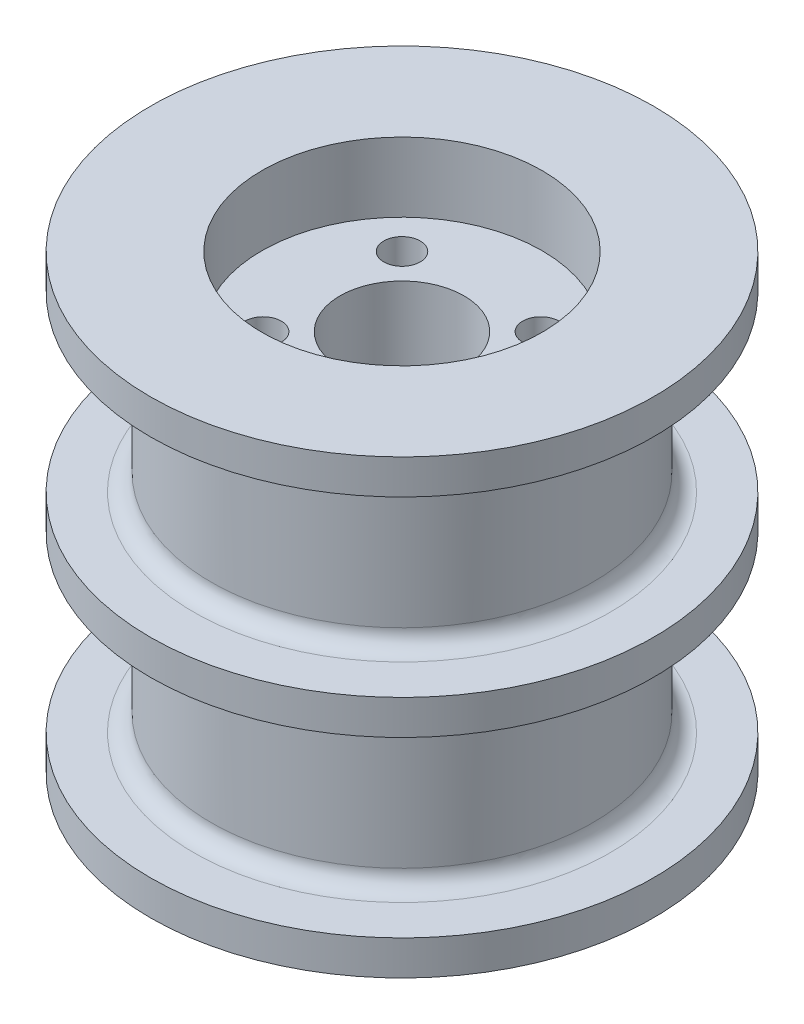
ISO-10303-21;
HEADER;
FILE_DESCRIPTION(('STEP AP214'),'2;1');
FILE_NAME('part.step','',(''),(''),'','','');
FILE_SCHEMA(('AUTOMOTIVE_DESIGN { 1 0 10303 214 1 1 1 1 }'));
ENDSEC;
DATA;
#1=APPLICATION_CONTEXT('core data for automotive mechanical design processes');
#2=APPLICATION_PROTOCOL_DEFINITION('international standard','automotive_design',2000,#1);
#3=PRODUCT_CONTEXT('',#1,'mechanical');
#4=PRODUCT('Part','Part','',(#3));
#5=PRODUCT_RELATED_PRODUCT_CATEGORY('part','',(#4));
#6=PRODUCT_DEFINITION_FORMATION('','',#4);
#7=PRODUCT_DEFINITION_CONTEXT('part definition',#1,'design');
#8=PRODUCT_DEFINITION('design','',#6,#7);
#9=PRODUCT_DEFINITION_SHAPE('','',#8);
#10=(LENGTH_UNIT() NAMED_UNIT(*) SI_UNIT(.MILLI.,.METRE.));
#11=(NAMED_UNIT(*) PLANE_ANGLE_UNIT() SI_UNIT($,.RADIAN.));
#12=(NAMED_UNIT(*) SI_UNIT($,.STERADIAN.) SOLID_ANGLE_UNIT());
#13=UNCERTAINTY_MEASURE_WITH_UNIT(LENGTH_MEASURE(1.E-05),#10,'distance_accuracy_value','');
#14=(GEOMETRIC_REPRESENTATION_CONTEXT(3) GLOBAL_UNCERTAINTY_ASSIGNED_CONTEXT((#13)) GLOBAL_UNIT_ASSIGNED_CONTEXT((#10,
#11,#12)) REPRESENTATION_CONTEXT('',''));
#15=CARTESIAN_POINT('',(0.,0.,0.));
#16=DIRECTION('',(0.,0.,1.));
#17=DIRECTION('',(1.,0.,0.));
#18=AXIS2_PLACEMENT_3D('',#15,#16,#17);
#19=CARTESIAN_POINT('',(0.,0.,0.));
#20=DIRECTION('',(0.,-1.,0.));
#21=DIRECTION('',(0.,0.,-1.));
#22=AXIS2_PLACEMENT_3D('',#19,#20,#21);
#23=CYLINDRICAL_SURFACE('',#22,16.15);
#24=CARTESIAN_POINT('',(0.,52.,0.));
#25=DIRECTION('',(0.,-1.,0.));
#26=DIRECTION('',(0.,0.,-1.));
#27=AXIS2_PLACEMENT_3D('',#24,#25,#26);
#28=CIRCLE('',#27,16.15);
#29=CARTESIAN_POINT('',(0.,52.,-16.15));
#30=VERTEX_POINT('',#29);
#31=EDGE_CURVE('E75',#30,#30,#28,.T.);
#32=ORIENTED_EDGE('',*,*,#31,.F.);
#33=EDGE_LOOP('',(#32));
#34=FACE_BOUND('',#33,.T.);
#35=CARTESIAN_POINT('',(0.,44.0000000000001,0.));
#36=DIRECTION('',(0.,-1.,0.));
#37=DIRECTION('',(0.,0.,-1.));
#38=AXIS2_PLACEMENT_3D('',#35,#36,#37);
#39=CIRCLE('',#38,16.15);
#40=CARTESIAN_POINT('',(0.,44.0000000000001,-16.15));
#41=VERTEX_POINT('',#40);
#42=EDGE_CURVE('E108',#41,#41,#39,.T.);
#43=ORIENTED_EDGE('',*,*,#42,.T.);
#44=EDGE_LOOP('',(#43));
#45=FACE_BOUND('',#44,.T.);
#46=ADVANCED_FACE('F43',(#34,#45),#23,.F.);
#47=CARTESIAN_POINT('',(0.,52.,16.15));
#48=DIRECTION('',(0.,-1.,0.));
#49=DIRECTION('',(0.,0.,-1.));
#50=AXIS2_PLACEMENT_3D('',#47,#48,#49);
#51=PLANE('',#50);
#52=CARTESIAN_POINT('',(0.,52.,0.));
#53=DIRECTION('',(0.,-1.,0.));
#54=DIRECTION('',(0.,0.,-1.));
#55=AXIS2_PLACEMENT_3D('',#52,#53,#54);
#56=CIRCLE('',#55,29.);
#57=CARTESIAN_POINT('',(0.,52.,-29.));
#58=VERTEX_POINT('',#57);
#59=EDGE_CURVE('E78',#58,#58,#56,.T.);
#60=ORIENTED_EDGE('',*,*,#59,.F.);
#61=EDGE_LOOP('',(#60));
#62=FACE_BOUND('',#61,.T.);
#63=ORIENTED_EDGE('',*,*,#31,.T.);
#64=EDGE_LOOP('',(#63));
#65=FACE_BOUND('',#64,.T.);
#66=ADVANCED_FACE('F195',(#62,#65),#51,.F.);
#67=CARTESIAN_POINT('',(0.,0.,0.));
#68=DIRECTION('',(0.,-1.,0.));
#69=DIRECTION('',(0.,0.,-1.));
#70=AXIS2_PLACEMENT_3D('',#67,#68,#69);
#71=CYLINDRICAL_SURFACE('',#70,29.);
#72=CARTESIAN_POINT('',(0.,48.,0.));
#73=DIRECTION('',(0.,-1.,0.));
#74=DIRECTION('',(0.,0.,-1.));
#75=AXIS2_PLACEMENT_3D('',#72,#73,#74);
#76=CIRCLE('',#75,29.);
#77=CARTESIAN_POINT('',(0.,48.,-29.));
#78=VERTEX_POINT('',#77);
#79=EDGE_CURVE('E81',#78,#78,#76,.T.);
#80=ORIENTED_EDGE('',*,*,#79,.F.);
#81=EDGE_LOOP('',(#80));
#82=FACE_BOUND('',#81,.T.);
#83=ORIENTED_EDGE('',*,*,#59,.T.);
#84=EDGE_LOOP('',(#83));
#85=FACE_BOUND('',#84,.T.);
#86=ADVANCED_FACE('F201',(#82,#85),#71,.T.);
#87=CARTESIAN_POINT('',(0.,48.,29.));
#88=DIRECTION('',(0.,1.,0.));
#89=DIRECTION('',(0.,0.,1.));
#90=AXIS2_PLACEMENT_3D('',#87,#88,#89);
#91=PLANE('',#90);
#92=CARTESIAN_POINT('',(0.,48.,0.));
#93=DIRECTION('',(0.,1.,0.));
#94=DIRECTION('',(0.,0.,1.));
#95=AXIS2_PLACEMENT_3D('',#92,#93,#94);
#96=CIRCLE('',#95,24.);
#97=CARTESIAN_POINT('',(0.,48.,24.));
#98=VERTEX_POINT('',#97);
#99=EDGE_CURVE('E50',#98,#98,#96,.T.);
#100=ORIENTED_EDGE('',*,*,#99,.T.);
#101=EDGE_LOOP('',(#100));
#102=FACE_BOUND('',#101,.T.);
#103=ORIENTED_EDGE('',*,*,#79,.T.);
#104=EDGE_LOOP('',(#103));
#105=FACE_BOUND('',#104,.T.);
#106=ADVANCED_FACE('F229',(#102,#105),#91,.F.);
#107=CARTESIAN_POINT('',(0.,0.,0.));
#108=DIRECTION('',(0.,-1.,0.));
#109=DIRECTION('',(0.,0.,-1.));
#110=AXIS2_PLACEMENT_3D('',#107,#108,#109);
#111=CYLINDRICAL_SURFACE('',#110,22.);
#112=CARTESIAN_POINT('',(0.,46.,0.));
#113=DIRECTION('',(0.,1.,0.));
#114=DIRECTION('',(0.,0.,1.));
#115=AXIS2_PLACEMENT_3D('',#112,#113,#114);
#116=CIRCLE('',#115,22.);
#117=CARTESIAN_POINT('',(0.,46.,22.));
#118=VERTEX_POINT('',#117);
#119=EDGE_CURVE('E54',#118,#118,#116,.F.);
#120=ORIENTED_EDGE('',*,*,#119,.T.);
#121=EDGE_LOOP('',(#120));
#122=FACE_BOUND('',#121,.T.);
#123=CARTESIAN_POINT('',(0.,30.,0.));
#124=DIRECTION('',(0.,-1.,0.));
#125=DIRECTION('',(0.,0.,-1.));
#126=AXIS2_PLACEMENT_3D('',#123,#124,#125);
#127=CIRCLE('',#126,22.);
#128=CARTESIAN_POINT('',(0.,30.,-22.));
#129=VERTEX_POINT('',#128);
#130=EDGE_CURVE('E58',#129,#129,#127,.F.);
#131=ORIENTED_EDGE('',*,*,#130,.T.);
#132=EDGE_LOOP('',(#131));
#133=FACE_BOUND('',#132,.T.);
#134=ADVANCED_FACE('F225',(#122,#133),#111,.T.);
#135=CARTESIAN_POINT('',(0.,28.,22.));
#136=DIRECTION('',(0.,-1.,0.));
#137=DIRECTION('',(0.,0.,-1.));
#138=AXIS2_PLACEMENT_3D('',#135,#136,#137);
#139=PLANE('',#138);
#140=CARTESIAN_POINT('',(0.,28.,0.));
#141=DIRECTION('',(0.,-1.,0.));
#142=DIRECTION('',(0.,0.,-1.));
#143=AXIS2_PLACEMENT_3D('',#140,#141,#142);
#144=CIRCLE('',#143,24.);
#145=CARTESIAN_POINT('',(0.,28.,-24.));
#146=VERTEX_POINT('',#145);
#147=EDGE_CURVE('E10',#146,#146,#144,.T.);
#148=ORIENTED_EDGE('',*,*,#147,.T.);
#149=EDGE_LOOP('',(#148));
#150=FACE_BOUND('',#149,.T.);
#151=CARTESIAN_POINT('',(0.,28.,0.));
#152=DIRECTION('',(0.,-1.,0.));
#153=DIRECTION('',(0.,0.,-1.));
#154=AXIS2_PLACEMENT_3D('',#151,#152,#153);
#155=CIRCLE('',#154,29.);
#156=CARTESIAN_POINT('',(0.,28.,-29.));
#157=VERTEX_POINT('',#156);
#158=EDGE_CURVE('E84',#157,#157,#155,.T.);
#159=ORIENTED_EDGE('',*,*,#158,.F.);
#160=EDGE_LOOP('',(#159));
#161=FACE_BOUND('',#160,.T.);
#162=ADVANCED_FACE('F228',(#150,#161),#139,.F.);
#163=CARTESIAN_POINT('',(0.,0.,0.));
#164=DIRECTION('',(0.,-1.,0.));
#165=DIRECTION('',(0.,0.,-1.));
#166=AXIS2_PLACEMENT_3D('',#163,#164,#165);
#167=CYLINDRICAL_SURFACE('',#166,29.);
#168=CARTESIAN_POINT('',(0.,24.,0.));
#169=DIRECTION('',(0.,-1.,0.));
#170=DIRECTION('',(0.,0.,-1.));
#171=AXIS2_PLACEMENT_3D('',#168,#169,#170);
#172=CIRCLE('',#171,29.);
#173=CARTESIAN_POINT('',(0.,24.,-29.));
#174=VERTEX_POINT('',#173);
#175=EDGE_CURVE('E87',#174,#174,#172,.T.);
#176=ORIENTED_EDGE('',*,*,#175,.F.);
#177=EDGE_LOOP('',(#176));
#178=FACE_BOUND('',#177,.T.);
#179=ORIENTED_EDGE('',*,*,#158,.T.);
#180=EDGE_LOOP('',(#179));
#181=FACE_BOUND('',#180,.T.);
#182=ADVANCED_FACE('F237',(#178,#181),#167,.T.);
#183=CARTESIAN_POINT('',(0.,24.,29.));
#184=DIRECTION('',(0.,1.,0.));
#185=DIRECTION('',(0.,0.,1.));
#186=AXIS2_PLACEMENT_3D('',#183,#184,#185);
#187=PLANE('',#186);
#188=CARTESIAN_POINT('',(0.,24.,0.));
#189=DIRECTION('',(0.,1.,0.));
#190=DIRECTION('',(0.,0.,1.));
#191=AXIS2_PLACEMENT_3D('',#188,#189,#190);
#192=CIRCLE('',#191,24.);
#193=CARTESIAN_POINT('',(0.,24.,24.));
#194=VERTEX_POINT('',#193);
#195=EDGE_CURVE('E66',#194,#194,#192,.T.);
#196=ORIENTED_EDGE('',*,*,#195,.T.);
#197=EDGE_LOOP('',(#196));
#198=FACE_BOUND('',#197,.T.);
#199=ORIENTED_EDGE('',*,*,#175,.T.);
#200=EDGE_LOOP('',(#199));
#201=FACE_BOUND('',#200,.T.);
#202=ADVANCED_FACE('F191',(#198,#201),#187,.F.);
#203=CARTESIAN_POINT('',(0.,0.,0.));
#204=DIRECTION('',(0.,-1.,0.));
#205=DIRECTION('',(0.,0.,-1.));
#206=AXIS2_PLACEMENT_3D('',#203,#204,#205);
#207=CYLINDRICAL_SURFACE('',#206,22.);
#208=CARTESIAN_POINT('',(0.,22.,0.));
#209=DIRECTION('',(0.,1.,0.));
#210=DIRECTION('',(0.,0.,1.));
#211=AXIS2_PLACEMENT_3D('',#208,#209,#210);
#212=CIRCLE('',#211,22.);
#213=CARTESIAN_POINT('',(0.,22.,22.));
#214=VERTEX_POINT('',#213);
#215=EDGE_CURVE('E69',#214,#214,#212,.F.);
#216=ORIENTED_EDGE('',*,*,#215,.T.);
#217=EDGE_LOOP('',(#216));
#218=FACE_BOUND('',#217,.T.);
#219=CARTESIAN_POINT('',(0.,6.,0.));
#220=DIRECTION('',(0.,-1.,0.));
#221=DIRECTION('',(0.,0.,-1.));
#222=AXIS2_PLACEMENT_3D('',#219,#220,#221);
#223=CIRCLE('',#222,22.);
#224=CARTESIAN_POINT('',(0.,6.,-22.));
#225=VERTEX_POINT('',#224);
#226=EDGE_CURVE('E72',#225,#225,#223,.F.);
#227=ORIENTED_EDGE('',*,*,#226,.T.);
#228=EDGE_LOOP('',(#227));
#229=FACE_BOUND('',#228,.T.);
#230=ADVANCED_FACE('F184',(#218,#229),#207,.T.);
#231=CARTESIAN_POINT('',(0.,4.,22.));
#232=DIRECTION('',(0.,-1.,0.));
#233=DIRECTION('',(0.,0.,-1.));
#234=AXIS2_PLACEMENT_3D('',#231,#232,#233);
#235=PLANE('',#234);
#236=CARTESIAN_POINT('',(0.,4.,0.));
#237=DIRECTION('',(0.,-1.,0.));
#238=DIRECTION('',(0.,0.,-1.));
#239=AXIS2_PLACEMENT_3D('',#236,#237,#238);
#240=CIRCLE('',#239,24.);
#241=CARTESIAN_POINT('',(0.,4.,-24.));
#242=VERTEX_POINT('',#241);
#243=EDGE_CURVE('E63',#242,#242,#240,.T.);
#244=ORIENTED_EDGE('',*,*,#243,.T.);
#245=EDGE_LOOP('',(#244));
#246=FACE_BOUND('',#245,.T.);
#247=CARTESIAN_POINT('',(0.,4.,0.));
#248=DIRECTION('',(0.,-1.,0.));
#249=DIRECTION('',(0.,0.,-1.));
#250=AXIS2_PLACEMENT_3D('',#247,#248,#249);
#251=CIRCLE('',#250,29.);
#252=CARTESIAN_POINT('',(0.,4.,-29.));
#253=VERTEX_POINT('',#252);
#254=EDGE_CURVE('E90',#253,#253,#251,.T.);
#255=ORIENTED_EDGE('',*,*,#254,.F.);
#256=EDGE_LOOP('',(#255));
#257=FACE_BOUND('',#256,.T.);
#258=ADVANCED_FACE('F179',(#246,#257),#235,.F.);
#259=CARTESIAN_POINT('',(0.,0.,0.));
#260=DIRECTION('',(0.,-1.,0.));
#261=DIRECTION('',(0.,0.,-1.));
#262=AXIS2_PLACEMENT_3D('',#259,#260,#261);
#263=CYLINDRICAL_SURFACE('',#262,29.);
#264=CARTESIAN_POINT('',(0.,0.,0.));
#265=DIRECTION('',(0.,-1.,0.));
#266=DIRECTION('',(0.,0.,-1.));
#267=AXIS2_PLACEMENT_3D('',#264,#265,#266);
#268=CIRCLE('',#267,29.);
#269=CARTESIAN_POINT('',(0.,0.,-29.));
#270=VERTEX_POINT('',#269);
#271=EDGE_CURVE('E93',#270,#270,#268,.T.);
#272=ORIENTED_EDGE('',*,*,#271,.F.);
#273=EDGE_LOOP('',(#272));
#274=FACE_BOUND('',#273,.T.);
#275=ORIENTED_EDGE('',*,*,#254,.T.);
#276=EDGE_LOOP('',(#275));
#277=FACE_BOUND('',#276,.T.);
#278=ADVANCED_FACE('F173',(#274,#277),#263,.T.);
#279=CARTESIAN_POINT('',(0.,0.,29.));
#280=DIRECTION('',(0.,1.,0.));
#281=DIRECTION('',(0.,0.,1.));
#282=AXIS2_PLACEMENT_3D('',#279,#280,#281);
#283=PLANE('',#282);
#284=CARTESIAN_POINT('',(0.,0.,0.));
#285=DIRECTION('',(0.,-1.,0.));
#286=DIRECTION('',(0.,0.,-1.));
#287=AXIS2_PLACEMENT_3D('',#284,#285,#286);
#288=CIRCLE('',#287,16.15);
#289=CARTESIAN_POINT('',(0.,0.,-16.15));
#290=VERTEX_POINT('',#289);
#291=EDGE_CURVE('E96',#290,#290,#288,.T.);
#292=ORIENTED_EDGE('',*,*,#291,.F.);
#293=EDGE_LOOP('',(#292));
#294=FACE_BOUND('',#293,.T.);
#295=ORIENTED_EDGE('',*,*,#271,.T.);
#296=EDGE_LOOP('',(#295));
#297=FACE_BOUND('',#296,.T.);
#298=ADVANCED_FACE('F167',(#294,#297),#283,.F.);
#299=CARTESIAN_POINT('',(0.,0.,0.));
#300=DIRECTION('',(0.,-1.,0.));
#301=DIRECTION('',(0.,0.,-1.));
#302=AXIS2_PLACEMENT_3D('',#299,#300,#301);
#303=CYLINDRICAL_SURFACE('',#302,16.15);
#304=CARTESIAN_POINT('',(0.,8.,0.));
#305=DIRECTION('',(0.,-1.,0.));
#306=DIRECTION('',(0.,0.,-1.));
#307=AXIS2_PLACEMENT_3D('',#304,#305,#306);
#308=CIRCLE('',#307,16.15);
#309=CARTESIAN_POINT('',(0.,8.,-16.15));
#310=VERTEX_POINT('',#309);
#311=EDGE_CURVE('E99',#310,#310,#308,.T.);
#312=ORIENTED_EDGE('',*,*,#311,.F.);
#313=EDGE_LOOP('',(#312));
#314=FACE_BOUND('',#313,.T.);
#315=ORIENTED_EDGE('',*,*,#291,.T.);
#316=EDGE_LOOP('',(#315));
#317=FACE_BOUND('',#316,.T.);
#318=ADVANCED_FACE('F160',(#314,#317),#303,.F.);
#319=CARTESIAN_POINT('',(0.,8.,16.15));
#320=DIRECTION('',(0.,1.,0.));
#321=DIRECTION('',(0.,0.,1.));
#322=AXIS2_PLACEMENT_3D('',#319,#320,#321);
#323=PLANE('',#322);
#324=CARTESIAN_POINT('',(-8.,8.,8.));
#325=DIRECTION('',(0.,1.,0.));
#326=DIRECTION('',(0.,0.,1.));
#327=AXIS2_PLACEMENT_3D('',#324,#325,#326);
#328=CIRCLE('',#327,2.1);
#329=CARTESIAN_POINT('',(-8.,8.,10.1));
#330=VERTEX_POINT('',#329);
#331=EDGE_CURVE('E111',#330,#330,#328,.T.);
#332=ORIENTED_EDGE('',*,*,#331,.T.);
#333=EDGE_LOOP('',(#332));
#334=FACE_BOUND('',#333,.T.);
#335=CARTESIAN_POINT('',(8.,8.,8.));
#336=DIRECTION('',(0.,1.,0.));
#337=DIRECTION('',(0.,0.,1.));
#338=AXIS2_PLACEMENT_3D('',#335,#336,#337);
#339=CIRCLE('',#338,2.1);
#340=CARTESIAN_POINT('',(8.,8.,10.1));
#341=VERTEX_POINT('',#340);
#342=EDGE_CURVE('E114',#341,#341,#339,.T.);
#343=ORIENTED_EDGE('',*,*,#342,.T.);
#344=EDGE_LOOP('',(#343));
#345=FACE_BOUND('',#344,.T.);
#346=CARTESIAN_POINT('',(8.,8.,-8.));
#347=DIRECTION('',(0.,1.,0.));
#348=DIRECTION('',(0.,0.,1.));
#349=AXIS2_PLACEMENT_3D('',#346,#347,#348);
#350=CIRCLE('',#349,2.1);
#351=CARTESIAN_POINT('',(8.,8.,-5.9));
#352=VERTEX_POINT('',#351);
#353=EDGE_CURVE('E117',#352,#352,#350,.T.);
#354=ORIENTED_EDGE('',*,*,#353,.T.);
#355=EDGE_LOOP('',(#354));
#356=FACE_BOUND('',#355,.T.);
#357=CARTESIAN_POINT('',(-8.,8.,-8.));
#358=DIRECTION('',(0.,1.,0.));
#359=DIRECTION('',(0.,0.,1.));
#360=AXIS2_PLACEMENT_3D('',#357,#358,#359);
#361=CIRCLE('',#360,2.1);
#362=CARTESIAN_POINT('',(-8.,8.,-5.9));
#363=VERTEX_POINT('',#362);
#364=EDGE_CURVE('E120',#363,#363,#361,.T.);
#365=ORIENTED_EDGE('',*,*,#364,.T.);
#366=EDGE_LOOP('',(#365));
#367=FACE_BOUND('',#366,.T.);
#368=CARTESIAN_POINT('',(0.,8.,0.));
#369=DIRECTION('',(0.,-1.,0.));
#370=DIRECTION('',(0.,0.,-1.));
#371=AXIS2_PLACEMENT_3D('',#368,#369,#370);
#372=CIRCLE('',#371,7.15);
#373=CARTESIAN_POINT('',(0.,8.,-7.15));
#374=VERTEX_POINT('',#373);
#375=EDGE_CURVE('E102',#374,#374,#372,.T.);
#376=ORIENTED_EDGE('',*,*,#375,.F.);
#377=EDGE_LOOP('',(#376));
#378=FACE_BOUND('',#377,.T.);
#379=ORIENTED_EDGE('',*,*,#311,.T.);
#380=EDGE_LOOP('',(#379));
#381=FACE_BOUND('',#380,.T.);
#382=ADVANCED_FACE('F154',(#334,#345,#356,#367,#378,#381),#323,.F.);
#383=CARTESIAN_POINT('',(0.,0.,0.));
#384=DIRECTION('',(0.,-1.,0.));
#385=DIRECTION('',(0.,0.,-1.));
#386=AXIS2_PLACEMENT_3D('',#383,#384,#385);
#387=CYLINDRICAL_SURFACE('',#386,7.15);
#388=CARTESIAN_POINT('',(0.,44.0000000000001,0.));
#389=DIRECTION('',(0.,-1.,0.));
#390=DIRECTION('',(0.,0.,-1.));
#391=AXIS2_PLACEMENT_3D('',#388,#389,#390);
#392=CIRCLE('',#391,7.15000000000001);
#393=CARTESIAN_POINT('',(0.,44.0000000000001,-7.15000000000001));
#394=VERTEX_POINT('',#393);
#395=EDGE_CURVE('E105',#394,#394,#392,.T.);
#396=ORIENTED_EDGE('',*,*,#395,.F.);
#397=EDGE_LOOP('',(#396));
#398=FACE_BOUND('',#397,.T.);
#399=ORIENTED_EDGE('',*,*,#375,.T.);
#400=EDGE_LOOP('',(#399));
#401=FACE_BOUND('',#400,.T.);
#402=ADVANCED_FACE('F143',(#398,#401),#387,.F.);
#403=CARTESIAN_POINT('',(0.,44.0000000000001,7.15000000000001));
#404=DIRECTION('',(0.,-1.,0.));
#405=DIRECTION('',(0.,0.,-1.));
#406=AXIS2_PLACEMENT_3D('',#403,#404,#405);
#407=PLANE('',#406);
#408=CARTESIAN_POINT('',(-8.,44.0000000000001,8.));
#409=DIRECTION('',(0.,1.,0.));
#410=DIRECTION('',(0.,0.,1.));
#411=AXIS2_PLACEMENT_3D('',#408,#409,#410);
#412=CIRCLE('',#411,2.1);
#413=CARTESIAN_POINT('',(-8.,44.0000000000001,10.1));
#414=VERTEX_POINT('',#413);
#415=EDGE_CURVE('E127',#414,#414,#412,.T.);
#416=ORIENTED_EDGE('',*,*,#415,.F.);
#417=EDGE_LOOP('',(#416));
#418=FACE_BOUND('',#417,.T.);
#419=CARTESIAN_POINT('',(8.,44.0000000000001,8.));
#420=DIRECTION('',(0.,1.,0.));
#421=DIRECTION('',(0.,0.,1.));
#422=AXIS2_PLACEMENT_3D('',#419,#420,#421);
#423=CIRCLE('',#422,2.1);
#424=CARTESIAN_POINT('',(8.,44.0000000000001,10.1));
#425=VERTEX_POINT('',#424);
#426=EDGE_CURVE('E130',#425,#425,#423,.T.);
#427=ORIENTED_EDGE('',*,*,#426,.F.);
#428=EDGE_LOOP('',(#427));
#429=FACE_BOUND('',#428,.T.);
#430=CARTESIAN_POINT('',(8.,44.0000000000001,-8.));
#431=DIRECTION('',(0.,1.,0.));
#432=DIRECTION('',(0.,0.,1.));
#433=AXIS2_PLACEMENT_3D('',#430,#431,#432);
#434=CIRCLE('',#433,2.1);
#435=CARTESIAN_POINT('',(8.,44.0000000000001,-5.9));
#436=VERTEX_POINT('',#435);
#437=EDGE_CURVE('E126',#436,#436,#434,.T.);
#438=ORIENTED_EDGE('',*,*,#437,.F.);
#439=EDGE_LOOP('',(#438));
#440=FACE_BOUND('',#439,.T.);
#441=CARTESIAN_POINT('',(-8.,44.0000000000001,-8.));
#442=DIRECTION('',(0.,1.,0.));
#443=DIRECTION('',(0.,0.,1.));
#444=AXIS2_PLACEMENT_3D('',#441,#442,#443);
#445=CIRCLE('',#444,2.1);
#446=CARTESIAN_POINT('',(-8.,44.0000000000001,-5.9));
#447=VERTEX_POINT('',#446);
#448=EDGE_CURVE('E123',#447,#447,#445,.T.);
#449=ORIENTED_EDGE('',*,*,#448,.F.);
#450=EDGE_LOOP('',(#449));
#451=FACE_BOUND('',#450,.T.);
#452=ORIENTED_EDGE('',*,*,#42,.F.);
#453=EDGE_LOOP('',(#452));
#454=FACE_BOUND('',#453,.T.);
#455=ORIENTED_EDGE('',*,*,#395,.T.);
#456=EDGE_LOOP('',(#455));
#457=FACE_BOUND('',#456,.T.);
#458=ADVANCED_FACE('F139',(#418,#429,#440,#451,#454,#457),#407,.F.);
#459=CARTESIAN_POINT('',(-8.,0.,-8.));
#460=DIRECTION('',(0.,1.,0.));
#461=DIRECTION('',(0.,0.,1.));
#462=AXIS2_PLACEMENT_3D('',#459,#460,#461);
#463=CYLINDRICAL_SURFACE('',#462,2.1);
#464=CARTESIAN_POINT('',(-8.,44.0000000000001,-5.9));
#465=CARTESIAN_POINT('',(-8.,43.6250000000001,-5.9));
#466=CARTESIAN_POINT('',(-8.,43.2500000000001,-5.9));
#467=CARTESIAN_POINT('',(-8.,42.5000000000001,-5.9));
#468=CARTESIAN_POINT('',(-8.,42.1250000000001,-5.9));
#469=CARTESIAN_POINT('',(-8.,41.3750000000001,-5.9));
#470=CARTESIAN_POINT('',(-8.,41.0000000000001,-5.9));
#471=CARTESIAN_POINT('',(-8.,40.2500000000001,-5.9));
#472=CARTESIAN_POINT('',(-8.,39.875,-5.9));
#473=CARTESIAN_POINT('',(-8.,39.125,-5.9));
#474=CARTESIAN_POINT('',(-8.,38.75,-5.9));
#475=CARTESIAN_POINT('',(-8.,38.,-5.9));
#476=CARTESIAN_POINT('',(-8.,37.625,-5.9));
#477=CARTESIAN_POINT('',(-8.,36.875,-5.9));
#478=CARTESIAN_POINT('',(-8.,36.5,-5.9));
#479=CARTESIAN_POINT('',(-8.,35.75,-5.9));
#480=CARTESIAN_POINT('',(-8.,35.375,-5.9));
#481=CARTESIAN_POINT('',(-8.,34.625,-5.9));
#482=CARTESIAN_POINT('',(-8.,34.25,-5.9));
#483=CARTESIAN_POINT('',(-8.,33.5,-5.9));
#484=CARTESIAN_POINT('',(-8.,33.125,-5.9));
#485=CARTESIAN_POINT('',(-8.,32.375,-5.9));
#486=CARTESIAN_POINT('',(-8.,32.,-5.9));
#487=CARTESIAN_POINT('',(-8.,31.25,-5.9));
#488=CARTESIAN_POINT('',(-8.,30.875,-5.9));
#489=CARTESIAN_POINT('',(-8.,30.125,-5.9));
#490=CARTESIAN_POINT('',(-8.,29.75,-5.9));
#491=CARTESIAN_POINT('',(-8.,29.,-5.9));
#492=CARTESIAN_POINT('',(-8.,28.625,-5.9));
#493=CARTESIAN_POINT('',(-8.,27.875,-5.9));
#494=CARTESIAN_POINT('',(-8.,27.5,-5.9));
#495=CARTESIAN_POINT('',(-8.,26.75,-5.9));
#496=CARTESIAN_POINT('',(-8.,26.375,-5.9));
#497=CARTESIAN_POINT('',(-8.,25.625,-5.9));
#498=CARTESIAN_POINT('',(-8.,25.25,-5.9));
#499=CARTESIAN_POINT('',(-8.,24.5,-5.9));
#500=CARTESIAN_POINT('',(-8.,24.125,-5.9));
#501=CARTESIAN_POINT('',(-8.,23.375,-5.9));
#502=CARTESIAN_POINT('',(-8.,23.,-5.9));
#503=CARTESIAN_POINT('',(-8.,22.25,-5.9));
#504=CARTESIAN_POINT('',(-8.,21.875,-5.9));
#505=CARTESIAN_POINT('',(-8.,21.125,-5.9));
#506=CARTESIAN_POINT('',(-8.,20.75,-5.9));
#507=CARTESIAN_POINT('',(-8.,20.,-5.9));
#508=CARTESIAN_POINT('',(-8.,19.625,-5.9));
#509=CARTESIAN_POINT('',(-8.,18.875,-5.9));
#510=CARTESIAN_POINT('',(-8.,18.5,-5.9));
#511=CARTESIAN_POINT('',(-8.,17.75,-5.9));
#512=CARTESIAN_POINT('',(-8.,17.375,-5.9));
#513=CARTESIAN_POINT('',(-8.,16.625,-5.9));
#514=CARTESIAN_POINT('',(-8.,16.25,-5.9));
#515=CARTESIAN_POINT('',(-8.,15.5,-5.9));
#516=CARTESIAN_POINT('',(-8.,15.125,-5.9));
#517=CARTESIAN_POINT('',(-8.,14.375,-5.9));
#518=CARTESIAN_POINT('',(-8.,14.,-5.9));
#519=CARTESIAN_POINT('',(-8.,13.25,-5.9));
#520=CARTESIAN_POINT('',(-8.,12.875,-5.9));
#521=CARTESIAN_POINT('',(-8.,12.125,-5.9));
#522=CARTESIAN_POINT('',(-8.,11.75,-5.9));
#523=CARTESIAN_POINT('',(-8.,11.,-5.9));
#524=CARTESIAN_POINT('',(-8.,10.625,-5.9));
#525=CARTESIAN_POINT('',(-8.,9.875,-5.9));
#526=CARTESIAN_POINT('',(-8.,9.5,-5.9));
#527=CARTESIAN_POINT('',(-8.,8.75,-5.9));
#528=CARTESIAN_POINT('',(-8.,8.375,-5.9));
#529=CARTESIAN_POINT('',(-8.,8.,-5.9));
#530=B_SPLINE_CURVE_WITH_KNOTS('',3,(#464,#465,#466,#467,#468,#469,#470,#471,#472,#473,#474,
#475,#476,#477,#478,#479,#480,#481,#482,#483,#484,#485,#486,#487,#488,#489,#490,#491,#492,#493,
#494,#495,#496,#497,#498,#499,#500,#501,#502,#503,#504,#505,#506,#507,#508,#509,#510,#511,#512,
#513,#514,#515,#516,#517,#518,#519,#520,#521,#522,#523,#524,#525,#526,#527,#528,#529),
.UNSPECIFIED.,.F.,.F.,(4,2,2,2,2,2,2,2,2,2,2,2,2,2,2,2,2,2,2,2,2,2,2,2,2,2,2,2,2,2,2,2,4),(0.,
1.125,2.25,3.375,4.50000000000001,5.62500000000001,6.75000000000001,7.87500000000001,
9.00000000000001,10.125,11.25,12.375,13.5,14.625,15.75,16.875,18.,19.125,20.25,21.375,22.5,
23.625,24.75,25.875,27.,28.125,29.25,30.375,31.5,32.6250000000001,33.7500000000001,
34.8750000000001,36.0000000000001),.UNSPECIFIED.);
#531=EDGE_CURVE('BSEAM142',#447,#363,#530,.T.);
#532=ORIENTED_EDGE('',*,*,#448,.T.);
#533=ORIENTED_EDGE('',*,*,#364,.F.);
#534=ORIENTED_EDGE('',*,*,#531,.T.);
#535=ORIENTED_EDGE('',*,*,#531,.F.);
#536=EDGE_LOOP('',(#532,#534,#533,#535));
#537=FACE_BOUND('',#536,.T.);
#538=ADVANCED_FACE('F142',(#537),#463,.F.);
#539=CARTESIAN_POINT('',(8.,0.,-8.));
#540=DIRECTION('',(0.,1.,0.));
#541=DIRECTION('',(0.,0.,1.));
#542=AXIS2_PLACEMENT_3D('',#539,#540,#541);
#543=CYLINDRICAL_SURFACE('',#542,2.1);
#544=CARTESIAN_POINT('',(8.,44.0000000000001,-5.9));
#545=CARTESIAN_POINT('',(8.,43.6250000000001,-5.9));
#546=CARTESIAN_POINT('',(8.,43.2500000000001,-5.9));
#547=CARTESIAN_POINT('',(8.,42.5000000000001,-5.9));
#548=CARTESIAN_POINT('',(8.,42.1250000000001,-5.9));
#549=CARTESIAN_POINT('',(8.,41.3750000000001,-5.9));
#550=CARTESIAN_POINT('',(8.,41.0000000000001,-5.9));
#551=CARTESIAN_POINT('',(8.,40.2500000000001,-5.9));
#552=CARTESIAN_POINT('',(8.,39.875,-5.9));
#553=CARTESIAN_POINT('',(8.,39.125,-5.9));
#554=CARTESIAN_POINT('',(8.,38.75,-5.9));
#555=CARTESIAN_POINT('',(8.,38.,-5.9));
#556=CARTESIAN_POINT('',(8.,37.625,-5.9));
#557=CARTESIAN_POINT('',(8.,36.875,-5.9));
#558=CARTESIAN_POINT('',(8.,36.5,-5.9));
#559=CARTESIAN_POINT('',(8.,35.75,-5.9));
#560=CARTESIAN_POINT('',(8.,35.375,-5.9));
#561=CARTESIAN_POINT('',(8.,34.625,-5.9));
#562=CARTESIAN_POINT('',(8.,34.25,-5.9));
#563=CARTESIAN_POINT('',(8.,33.5,-5.9));
#564=CARTESIAN_POINT('',(8.,33.125,-5.9));
#565=CARTESIAN_POINT('',(8.,32.375,-5.9));
#566=CARTESIAN_POINT('',(8.,32.,-5.9));
#567=CARTESIAN_POINT('',(8.,31.25,-5.9));
#568=CARTESIAN_POINT('',(8.,30.875,-5.9));
#569=CARTESIAN_POINT('',(8.,30.125,-5.9));
#570=CARTESIAN_POINT('',(8.,29.75,-5.9));
#571=CARTESIAN_POINT('',(8.,29.,-5.9));
#572=CARTESIAN_POINT('',(8.,28.625,-5.9));
#573=CARTESIAN_POINT('',(8.,27.875,-5.9));
#574=CARTESIAN_POINT('',(8.,27.5,-5.9));
#575=CARTESIAN_POINT('',(8.,26.75,-5.9));
#576=CARTESIAN_POINT('',(8.,26.375,-5.9));
#577=CARTESIAN_POINT('',(8.,25.625,-5.9));
#578=CARTESIAN_POINT('',(8.,25.25,-5.9));
#579=CARTESIAN_POINT('',(8.,24.5,-5.9));
#580=CARTESIAN_POINT('',(8.,24.125,-5.9));
#581=CARTESIAN_POINT('',(8.,23.375,-5.9));
#582=CARTESIAN_POINT('',(8.,23.,-5.9));
#583=CARTESIAN_POINT('',(8.,22.25,-5.9));
#584=CARTESIAN_POINT('',(8.,21.875,-5.9));
#585=CARTESIAN_POINT('',(8.,21.125,-5.9));
#586=CARTESIAN_POINT('',(8.,20.75,-5.9));
#587=CARTESIAN_POINT('',(8.,20.,-5.9));
#588=CARTESIAN_POINT('',(8.,19.625,-5.9));
#589=CARTESIAN_POINT('',(8.,18.875,-5.9));
#590=CARTESIAN_POINT('',(8.,18.5,-5.9));
#591=CARTESIAN_POINT('',(8.,17.75,-5.9));
#592=CARTESIAN_POINT('',(8.,17.375,-5.9));
#593=CARTESIAN_POINT('',(8.,16.625,-5.9));
#594=CARTESIAN_POINT('',(8.,16.25,-5.9));
#595=CARTESIAN_POINT('',(8.,15.5,-5.9));
#596=CARTESIAN_POINT('',(8.,15.125,-5.9));
#597=CARTESIAN_POINT('',(8.,14.375,-5.9));
#598=CARTESIAN_POINT('',(8.,14.,-5.9));
#599=CARTESIAN_POINT('',(8.,13.25,-5.9));
#600=CARTESIAN_POINT('',(8.,12.875,-5.9));
#601=CARTESIAN_POINT('',(8.,12.125,-5.9));
#602=CARTESIAN_POINT('',(8.,11.75,-5.9));
#603=CARTESIAN_POINT('',(8.,11.,-5.9));
#604=CARTESIAN_POINT('',(8.,10.625,-5.9));
#605=CARTESIAN_POINT('',(8.,9.875,-5.9));
#606=CARTESIAN_POINT('',(8.,9.5,-5.9));
#607=CARTESIAN_POINT('',(8.,8.75,-5.9));
#608=CARTESIAN_POINT('',(8.,8.375,-5.9));
#609=CARTESIAN_POINT('',(8.,8.,-5.9));
#610=B_SPLINE_CURVE_WITH_KNOTS('',3,(#544,#545,#546,#547,#548,#549,#550,#551,#552,#553,#554,
#555,#556,#557,#558,#559,#560,#561,#562,#563,#564,#565,#566,#567,#568,#569,#570,#571,#572,#573,
#574,#575,#576,#577,#578,#579,#580,#581,#582,#583,#584,#585,#586,#587,#588,#589,#590,#591,#592,
#593,#594,#595,#596,#597,#598,#599,#600,#601,#602,#603,#604,#605,#606,#607,#608,#609),
.UNSPECIFIED.,.F.,.F.,(4,2,2,2,2,2,2,2,2,2,2,2,2,2,2,2,2,2,2,2,2,2,2,2,2,2,2,2,2,2,2,2,4),(0.,
1.125,2.25,3.375,4.50000000000001,5.62500000000001,6.75000000000001,7.87500000000001,
9.00000000000001,10.125,11.25,12.375,13.5,14.625,15.75,16.875,18.,19.125,20.25,21.375,22.5,
23.625,24.75,25.875,27.,28.125,29.25,30.375,31.5,32.6250000000001,33.7500000000001,
34.8750000000001,36.0000000000001),.UNSPECIFIED.);
#611=EDGE_CURVE('BSEAM136',#436,#352,#610,.T.);
#612=ORIENTED_EDGE('',*,*,#437,.T.);
#613=ORIENTED_EDGE('',*,*,#353,.F.);
#614=ORIENTED_EDGE('',*,*,#611,.T.);
#615=ORIENTED_EDGE('',*,*,#611,.F.);
#616=EDGE_LOOP('',(#612,#614,#613,#615));
#617=FACE_BOUND('',#616,.T.);
#618=ADVANCED_FACE('F136',(#617),#543,.F.);
#619=CARTESIAN_POINT('',(8.,0.,8.));
#620=DIRECTION('',(0.,1.,0.));
#621=DIRECTION('',(0.,0.,1.));
#622=AXIS2_PLACEMENT_3D('',#619,#620,#621);
#623=CYLINDRICAL_SURFACE('',#622,2.1);
#624=CARTESIAN_POINT('',(8.,44.0000000000001,10.1));
#625=CARTESIAN_POINT('',(8.,43.6250000000001,10.1));
#626=CARTESIAN_POINT('',(8.,43.2500000000001,10.1));
#627=CARTESIAN_POINT('',(8.,42.5000000000001,10.1));
#628=CARTESIAN_POINT('',(8.,42.1250000000001,10.1));
#629=CARTESIAN_POINT('',(8.,41.3750000000001,10.1));
#630=CARTESIAN_POINT('',(8.,41.0000000000001,10.1));
#631=CARTESIAN_POINT('',(8.,40.2500000000001,10.1));
#632=CARTESIAN_POINT('',(8.,39.875,10.1));
#633=CARTESIAN_POINT('',(8.,39.125,10.1));
#634=CARTESIAN_POINT('',(8.,38.75,10.1));
#635=CARTESIAN_POINT('',(8.,38.,10.1));
#636=CARTESIAN_POINT('',(8.,37.625,10.1));
#637=CARTESIAN_POINT('',(8.,36.875,10.1));
#638=CARTESIAN_POINT('',(8.,36.5,10.1));
#639=CARTESIAN_POINT('',(8.,35.75,10.1));
#640=CARTESIAN_POINT('',(8.,35.375,10.1));
#641=CARTESIAN_POINT('',(8.,34.625,10.1));
#642=CARTESIAN_POINT('',(8.,34.25,10.1));
#643=CARTESIAN_POINT('',(8.,33.5,10.1));
#644=CARTESIAN_POINT('',(8.,33.125,10.1));
#645=CARTESIAN_POINT('',(8.,32.375,10.1));
#646=CARTESIAN_POINT('',(8.,32.,10.1));
#647=CARTESIAN_POINT('',(8.,31.25,10.1));
#648=CARTESIAN_POINT('',(8.,30.875,10.1));
#649=CARTESIAN_POINT('',(8.,30.125,10.1));
#650=CARTESIAN_POINT('',(8.,29.75,10.1));
#651=CARTESIAN_POINT('',(8.,29.,10.1));
#652=CARTESIAN_POINT('',(8.,28.625,10.1));
#653=CARTESIAN_POINT('',(8.,27.875,10.1));
#654=CARTESIAN_POINT('',(8.,27.5,10.1));
#655=CARTESIAN_POINT('',(8.,26.75,10.1));
#656=CARTESIAN_POINT('',(8.,26.375,10.1));
#657=CARTESIAN_POINT('',(8.,25.625,10.1));
#658=CARTESIAN_POINT('',(8.,25.25,10.1));
#659=CARTESIAN_POINT('',(8.,24.5,10.1));
#660=CARTESIAN_POINT('',(8.,24.125,10.1));
#661=CARTESIAN_POINT('',(8.,23.375,10.1));
#662=CARTESIAN_POINT('',(8.,23.,10.1));
#663=CARTESIAN_POINT('',(8.,22.25,10.1));
#664=CARTESIAN_POINT('',(8.,21.875,10.1));
#665=CARTESIAN_POINT('',(8.,21.125,10.1));
#666=CARTESIAN_POINT('',(8.,20.75,10.1));
#667=CARTESIAN_POINT('',(8.,20.,10.1));
#668=CARTESIAN_POINT('',(8.,19.625,10.1));
#669=CARTESIAN_POINT('',(8.,18.875,10.1));
#670=CARTESIAN_POINT('',(8.,18.5,10.1));
#671=CARTESIAN_POINT('',(8.,17.75,10.1));
#672=CARTESIAN_POINT('',(8.,17.375,10.1));
#673=CARTESIAN_POINT('',(8.,16.625,10.1));
#674=CARTESIAN_POINT('',(8.,16.25,10.1));
#675=CARTESIAN_POINT('',(8.,15.5,10.1));
#676=CARTESIAN_POINT('',(8.,15.125,10.1));
#677=CARTESIAN_POINT('',(8.,14.375,10.1));
#678=CARTESIAN_POINT('',(8.,14.,10.1));
#679=CARTESIAN_POINT('',(8.,13.25,10.1));
#680=CARTESIAN_POINT('',(8.,12.875,10.1));
#681=CARTESIAN_POINT('',(8.,12.125,10.1));
#682=CARTESIAN_POINT('',(8.,11.75,10.1));
#683=CARTESIAN_POINT('',(8.,11.,10.1));
#684=CARTESIAN_POINT('',(8.,10.625,10.1));
#685=CARTESIAN_POINT('',(8.,9.875,10.1));
#686=CARTESIAN_POINT('',(8.,9.5,10.1));
#687=CARTESIAN_POINT('',(8.,8.75,10.1));
#688=CARTESIAN_POINT('',(8.,8.375,10.1));
#689=CARTESIAN_POINT('',(8.,8.,10.1));
#690=B_SPLINE_CURVE_WITH_KNOTS('',3,(#624,#625,#626,#627,#628,#629,#630,#631,#632,#633,#634,
#635,#636,#637,#638,#639,#640,#641,#642,#643,#644,#645,#646,#647,#648,#649,#650,#651,#652,#653,
#654,#655,#656,#657,#658,#659,#660,#661,#662,#663,#664,#665,#666,#667,#668,#669,#670,#671,#672,
#673,#674,#675,#676,#677,#678,#679,#680,#681,#682,#683,#684,#685,#686,#687,#688,#689),
.UNSPECIFIED.,.F.,.F.,(4,2,2,2,2,2,2,2,2,2,2,2,2,2,2,2,2,2,2,2,2,2,2,2,2,2,2,2,2,2,2,2,4),(0.,
1.125,2.25,3.375,4.50000000000001,5.62500000000001,6.75000000000001,7.87500000000001,
9.00000000000001,10.125,11.25,12.375,13.5,14.625,15.75,16.875,18.,19.125,20.25,21.375,22.5,
23.625,24.75,25.875,27.,28.125,29.25,30.375,31.5,32.6250000000001,33.7500000000001,
34.8750000000001,36.0000000000001),.UNSPECIFIED.);
#691=EDGE_CURVE('BSEAM307',#425,#341,#690,.T.);
#692=ORIENTED_EDGE('',*,*,#426,.T.);
#693=ORIENTED_EDGE('',*,*,#342,.F.);
#694=ORIENTED_EDGE('',*,*,#691,.T.);
#695=ORIENTED_EDGE('',*,*,#691,.F.);
#696=EDGE_LOOP('',(#692,#694,#693,#695));
#697=FACE_BOUND('',#696,.T.);
#698=ADVANCED_FACE('F307',(#697),#623,.F.);
#699=CARTESIAN_POINT('',(-8.,0.,8.));
#700=DIRECTION('',(0.,1.,0.));
#701=DIRECTION('',(0.,0.,1.));
#702=AXIS2_PLACEMENT_3D('',#699,#700,#701);
#703=CYLINDRICAL_SURFACE('',#702,2.1);
#704=CARTESIAN_POINT('',(-8.,44.0000000000001,10.1));
#705=CARTESIAN_POINT('',(-8.,43.6250000000001,10.1));
#706=CARTESIAN_POINT('',(-8.,43.2500000000001,10.1));
#707=CARTESIAN_POINT('',(-8.,42.5000000000001,10.1));
#708=CARTESIAN_POINT('',(-8.,42.1250000000001,10.1));
#709=CARTESIAN_POINT('',(-8.,41.3750000000001,10.1));
#710=CARTESIAN_POINT('',(-8.,41.0000000000001,10.1));
#711=CARTESIAN_POINT('',(-8.,40.2500000000001,10.1));
#712=CARTESIAN_POINT('',(-8.,39.875,10.1));
#713=CARTESIAN_POINT('',(-8.,39.125,10.1));
#714=CARTESIAN_POINT('',(-8.,38.75,10.1));
#715=CARTESIAN_POINT('',(-8.,38.,10.1));
#716=CARTESIAN_POINT('',(-8.,37.625,10.1));
#717=CARTESIAN_POINT('',(-8.,36.875,10.1));
#718=CARTESIAN_POINT('',(-8.,36.5,10.1));
#719=CARTESIAN_POINT('',(-8.,35.75,10.1));
#720=CARTESIAN_POINT('',(-8.,35.375,10.1));
#721=CARTESIAN_POINT('',(-8.,34.625,10.1));
#722=CARTESIAN_POINT('',(-8.,34.25,10.1));
#723=CARTESIAN_POINT('',(-8.,33.5,10.1));
#724=CARTESIAN_POINT('',(-8.,33.125,10.1));
#725=CARTESIAN_POINT('',(-8.,32.375,10.1));
#726=CARTESIAN_POINT('',(-8.,32.,10.1));
#727=CARTESIAN_POINT('',(-8.,31.25,10.1));
#728=CARTESIAN_POINT('',(-8.,30.875,10.1));
#729=CARTESIAN_POINT('',(-8.,30.125,10.1));
#730=CARTESIAN_POINT('',(-8.,29.75,10.1));
#731=CARTESIAN_POINT('',(-8.,29.,10.1));
#732=CARTESIAN_POINT('',(-8.,28.625,10.1));
#733=CARTESIAN_POINT('',(-8.,27.875,10.1));
#734=CARTESIAN_POINT('',(-8.,27.5,10.1));
#735=CARTESIAN_POINT('',(-8.,26.75,10.1));
#736=CARTESIAN_POINT('',(-8.,26.375,10.1));
#737=CARTESIAN_POINT('',(-8.,25.625,10.1));
#738=CARTESIAN_POINT('',(-8.,25.25,10.1));
#739=CARTESIAN_POINT('',(-8.,24.5,10.1));
#740=CARTESIAN_POINT('',(-8.,24.125,10.1));
#741=CARTESIAN_POINT('',(-8.,23.375,10.1));
#742=CARTESIAN_POINT('',(-8.,23.,10.1));
#743=CARTESIAN_POINT('',(-8.,22.25,10.1));
#744=CARTESIAN_POINT('',(-8.,21.875,10.1));
#745=CARTESIAN_POINT('',(-8.,21.125,10.1));
#746=CARTESIAN_POINT('',(-8.,20.75,10.1));
#747=CARTESIAN_POINT('',(-8.,20.,10.1));
#748=CARTESIAN_POINT('',(-8.,19.625,10.1));
#749=CARTESIAN_POINT('',(-8.,18.875,10.1));
#750=CARTESIAN_POINT('',(-8.,18.5,10.1));
#751=CARTESIAN_POINT('',(-8.,17.75,10.1));
#752=CARTESIAN_POINT('',(-8.,17.375,10.1));
#753=CARTESIAN_POINT('',(-8.,16.625,10.1));
#754=CARTESIAN_POINT('',(-8.,16.25,10.1));
#755=CARTESIAN_POINT('',(-8.,15.5,10.1));
#756=CARTESIAN_POINT('',(-8.,15.125,10.1));
#757=CARTESIAN_POINT('',(-8.,14.375,10.1));
#758=CARTESIAN_POINT('',(-8.,14.,10.1));
#759=CARTESIAN_POINT('',(-8.,13.25,10.1));
#760=CARTESIAN_POINT('',(-8.,12.875,10.1));
#761=CARTESIAN_POINT('',(-8.,12.125,10.1));
#762=CARTESIAN_POINT('',(-8.,11.75,10.1));
#763=CARTESIAN_POINT('',(-8.,11.,10.1));
#764=CARTESIAN_POINT('',(-8.,10.625,10.1));
#765=CARTESIAN_POINT('',(-8.,9.875,10.1));
#766=CARTESIAN_POINT('',(-8.,9.5,10.1));
#767=CARTESIAN_POINT('',(-8.,8.75,10.1));
#768=CARTESIAN_POINT('',(-8.,8.375,10.1));
#769=CARTESIAN_POINT('',(-8.,8.,10.1));
#770=B_SPLINE_CURVE_WITH_KNOTS('',3,(#704,#705,#706,#707,#708,#709,#710,#711,#712,#713,#714,
#715,#716,#717,#718,#719,#720,#721,#722,#723,#724,#725,#726,#727,#728,#729,#730,#731,#732,#733,
#734,#735,#736,#737,#738,#739,#740,#741,#742,#743,#744,#745,#746,#747,#748,#749,#750,#751,#752,
#753,#754,#755,#756,#757,#758,#759,#760,#761,#762,#763,#764,#765,#766,#767,#768,#769),
.UNSPECIFIED.,.F.,.F.,(4,2,2,2,2,2,2,2,2,2,2,2,2,2,2,2,2,2,2,2,2,2,2,2,2,2,2,2,2,2,2,2,4),(0.,
1.125,2.25,3.375,4.50000000000001,5.62500000000001,6.75000000000001,7.87500000000001,
9.00000000000001,10.125,11.25,12.375,13.5,14.625,15.75,16.875,18.,19.125,20.25,21.375,22.5,
23.625,24.75,25.875,27.,28.125,29.25,30.375,31.5,32.6250000000001,33.7500000000001,
34.8750000000001,36.0000000000001),.UNSPECIFIED.);
#771=EDGE_CURVE('BSEAM211',#414,#330,#770,.T.);
#772=ORIENTED_EDGE('',*,*,#415,.T.);
#773=ORIENTED_EDGE('',*,*,#331,.F.);
#774=ORIENTED_EDGE('',*,*,#771,.T.);
#775=ORIENTED_EDGE('',*,*,#771,.F.);
#776=EDGE_LOOP('',(#772,#774,#773,#775));
#777=FACE_BOUND('',#776,.T.);
#778=ADVANCED_FACE('F211',(#777),#703,.F.);
#779=CARTESIAN_POINT('',(0.,22.,0.));
#780=DIRECTION('',(0.,1.,0.));
#781=DIRECTION('',(0.,0.,1.));
#782=AXIS2_PLACEMENT_3D('',#779,#780,#781);
#783=TOROIDAL_SURFACE('',#782,24.,2.);
#784=ORIENTED_EDGE('',*,*,#195,.F.);
#785=EDGE_LOOP('',(#784));
#786=FACE_BOUND('',#785,.T.);
#787=ORIENTED_EDGE('',*,*,#215,.F.);
#788=EDGE_LOOP('',(#787));
#789=FACE_BOUND('',#788,.T.);
#790=ADVANCED_FACE('F208',(#786,#789),#783,.F.);
#791=CARTESIAN_POINT('',(0.,6.,0.));
#792=DIRECTION('',(0.,-1.,0.));
#793=DIRECTION('',(0.,0.,-1.));
#794=AXIS2_PLACEMENT_3D('',#791,#792,#793);
#795=TOROIDAL_SURFACE('',#794,24.,2.);
#796=ORIENTED_EDGE('',*,*,#226,.F.);
#797=EDGE_LOOP('',(#796));
#798=FACE_BOUND('',#797,.T.);
#799=ORIENTED_EDGE('',*,*,#243,.F.);
#800=EDGE_LOOP('',(#799));
#801=FACE_BOUND('',#800,.T.);
#802=ADVANCED_FACE('F210',(#798,#801),#795,.F.);
#803=CARTESIAN_POINT('',(0.,46.,0.));
#804=DIRECTION('',(0.,1.,0.));
#805=DIRECTION('',(0.,0.,1.));
#806=AXIS2_PLACEMENT_3D('',#803,#804,#805);
#807=TOROIDAL_SURFACE('',#806,24.,2.);
#808=ORIENTED_EDGE('',*,*,#99,.F.);
#809=EDGE_LOOP('',(#808));
#810=FACE_BOUND('',#809,.T.);
#811=ORIENTED_EDGE('',*,*,#119,.F.);
#812=EDGE_LOOP('',(#811));
#813=FACE_BOUND('',#812,.T.);
#814=ADVANCED_FACE('F214',(#810,#813),#807,.F.);
#815=CARTESIAN_POINT('',(0.,30.,0.));
#816=DIRECTION('',(0.,-1.,0.));
#817=DIRECTION('',(0.,0.,-1.));
#818=AXIS2_PLACEMENT_3D('',#815,#816,#817);
#819=TOROIDAL_SURFACE('',#818,24.,2.);
#820=ORIENTED_EDGE('',*,*,#130,.F.);
#821=EDGE_LOOP('',(#820));
#822=FACE_BOUND('',#821,.T.);
#823=ORIENTED_EDGE('',*,*,#147,.F.);
#824=EDGE_LOOP('',(#823));
#825=FACE_BOUND('',#824,.T.);
#826=ADVANCED_FACE('F45',(#822,#825),#819,.F.);
#827=CLOSED_SHELL('',(#46,#66,#86,#106,#134,#162,#182,#202,#230,#258,#278,#298,#318,#382,#402,
#458,#538,#618,#698,#778,#790,#802,#814,#826));
#828=MANIFOLD_SOLID_BREP('B2',#827);
#829=ADVANCED_BREP_SHAPE_REPRESENTATION('',(#18,#828),#14);
#830=SHAPE_DEFINITION_REPRESENTATION(#9,#829);
ENDSEC;
END-ISO-10303-21;
